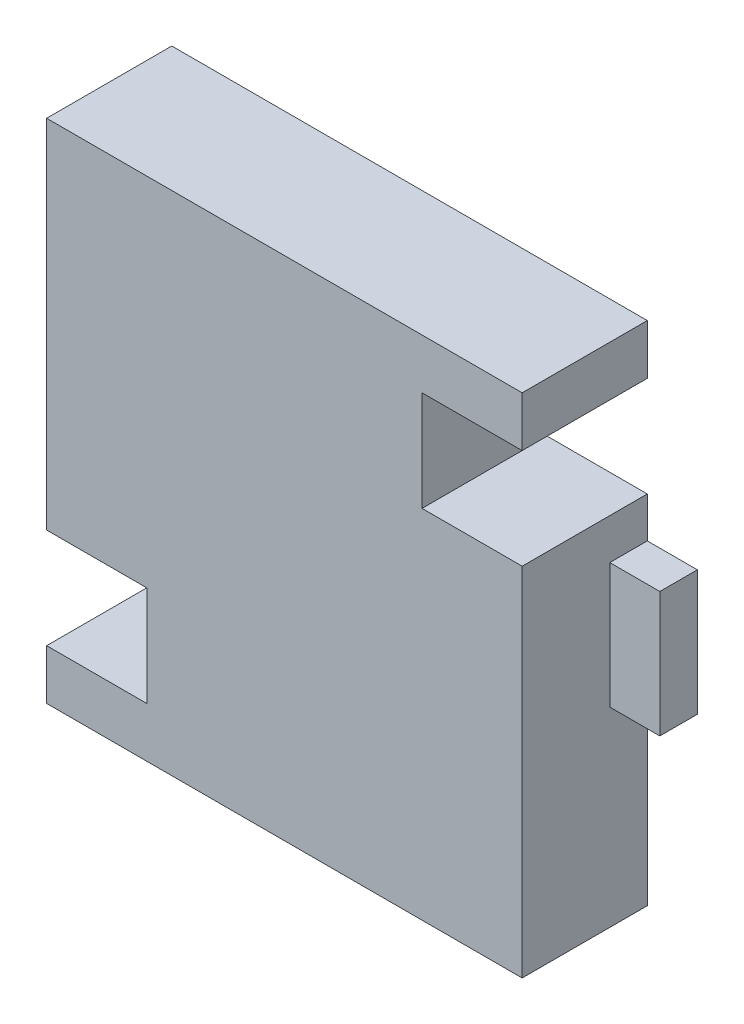
ISO-10303-21;
HEADER;
FILE_DESCRIPTION(('STEP AP214'),'2;1');
FILE_NAME('part.step','',(''),(''),'','','');
FILE_SCHEMA(('AUTOMOTIVE_DESIGN { 1 0 10303 214 1 1 1 1 }'));
ENDSEC;
DATA;
#1=APPLICATION_CONTEXT('core data for automotive mechanical design processes');
#2=APPLICATION_PROTOCOL_DEFINITION('international standard','automotive_design',2000,#1);
#3=PRODUCT_CONTEXT('',#1,'mechanical');
#4=PRODUCT('Part','Part','',(#3));
#5=PRODUCT_RELATED_PRODUCT_CATEGORY('part','',(#4));
#6=PRODUCT_DEFINITION_FORMATION('','',#4);
#7=PRODUCT_DEFINITION_CONTEXT('part definition',#1,'design');
#8=PRODUCT_DEFINITION('design','',#6,#7);
#9=PRODUCT_DEFINITION_SHAPE('','',#8);
#10=(LENGTH_UNIT() NAMED_UNIT(*) SI_UNIT(.MILLI.,.METRE.));
#11=(NAMED_UNIT(*) PLANE_ANGLE_UNIT() SI_UNIT($,.RADIAN.));
#12=(NAMED_UNIT(*) SI_UNIT($,.STERADIAN.) SOLID_ANGLE_UNIT());
#13=UNCERTAINTY_MEASURE_WITH_UNIT(LENGTH_MEASURE(1.E-05),#10,'distance_accuracy_value','');
#14=(GEOMETRIC_REPRESENTATION_CONTEXT(3) GLOBAL_UNCERTAINTY_ASSIGNED_CONTEXT((#13)) GLOBAL_UNIT_ASSIGNED_CONTEXT((#10,
#11,#12)) REPRESENTATION_CONTEXT('',''));
#15=CARTESIAN_POINT('',(0.,0.,0.));
#16=DIRECTION('',(0.,0.,1.));
#17=DIRECTION('',(1.,0.,0.));
#18=AXIS2_PLACEMENT_3D('',#15,#16,#17);
#19=CARTESIAN_POINT('',(0.,0.,3.));
#20=DIRECTION('',(0.,0.,1.));
#21=DIRECTION('',(1.,0.,0.));
#22=AXIS2_PLACEMENT_3D('',#19,#20,#21);
#23=PLANE('',#22);
#24=DIRECTION('',(0.,1.,0.));
#25=VECTOR('',#24,1.);
#26=CARTESIAN_POINT('',(38.,-40.5,3.));
#27=LINE('',#26,#25);
#28=CARTESIAN_POINT('',(38.,-25.25,3.));
#29=VERTEX_POINT('',#28);
#30=CARTESIAN_POINT('',(38.,-15.25,3.));
#31=VERTEX_POINT('',#30);
#32=EDGE_CURVE('E11',#29,#31,#27,.T.);
#33=ORIENTED_EDGE('',*,*,#32,.F.);
#34=DIRECTION('',(1.,0.,0.));
#35=VECTOR('',#34,1.);
#36=CARTESIAN_POINT('',(42.,-25.25,3.));
#37=LINE('',#36,#35);
#38=CARTESIAN_POINT('',(42.,-25.25,3.));
#39=VERTEX_POINT('',#38);
#40=EDGE_CURVE('E155',#29,#39,#37,.T.);
#41=ORIENTED_EDGE('',*,*,#40,.T.);
#42=DIRECTION('',(0.,1.,0.));
#43=VECTOR('',#42,1.);
#44=CARTESIAN_POINT('',(42.,-15.25,3.));
#45=LINE('',#44,#43);
#46=CARTESIAN_POINT('',(42.,-15.25,3.));
#47=VERTEX_POINT('',#46);
#48=EDGE_CURVE('E158',#39,#47,#45,.T.);
#49=ORIENTED_EDGE('',*,*,#48,.T.);
#50=DIRECTION('',(-1.,0.,0.));
#51=VECTOR('',#50,1.);
#52=CARTESIAN_POINT('',(38.,-15.25,3.));
#53=LINE('',#52,#51);
#54=EDGE_CURVE('E60',#47,#31,#53,.T.);
#55=ORIENTED_EDGE('',*,*,#54,.T.);
#56=EDGE_LOOP('',(#33,#41,#49,#55));
#57=FACE_BOUND('',#56,.T.);
#58=ADVANCED_FACE('F41',(#57),#23,.T.);
#59=CARTESIAN_POINT('',(38.,0.,3.));
#60=DIRECTION('',(0.,-1.,0.));
#61=DIRECTION('',(1.,0.,0.));
#62=AXIS2_PLACEMENT_3D('',#59,#60,#61);
#63=PLANE('',#62);
#64=DIRECTION('',(-1.,0.,0.));
#65=VECTOR('',#64,1.);
#66=CARTESIAN_POINT('',(38.,0.,0.));
#67=LINE('',#66,#65);
#68=CARTESIAN_POINT('',(38.,0.,0.));
#69=VERTEX_POINT('',#68);
#70=CARTESIAN_POINT('',(0.,0.,0.));
#71=VERTEX_POINT('',#70);
#72=EDGE_CURVE('E182',#69,#71,#67,.T.);
#73=ORIENTED_EDGE('',*,*,#72,.T.);
#74=DIRECTION('',(0.,0.,-1.));
#75=VECTOR('',#74,1.);
#76=CARTESIAN_POINT('',(0.,0.,3.));
#77=LINE('',#76,#75);
#78=CARTESIAN_POINT('',(0.,0.,10.));
#79=VERTEX_POINT('',#78);
#80=EDGE_CURVE('E45',#79,#71,#77,.T.);
#81=ORIENTED_EDGE('',*,*,#80,.F.);
#82=DIRECTION('',(-1.,0.,0.));
#83=VECTOR('',#82,1.);
#84=CARTESIAN_POINT('',(38.,0.,10.));
#85=LINE('',#84,#83);
#86=CARTESIAN_POINT('',(38.,0.,10.));
#87=VERTEX_POINT('',#86);
#88=EDGE_CURVE('E348',#87,#79,#85,.T.);
#89=ORIENTED_EDGE('',*,*,#88,.F.);
#90=DIRECTION('',(0.,0.,-1.));
#91=VECTOR('',#90,1.);
#92=CARTESIAN_POINT('',(38.,0.,3.));
#93=LINE('',#92,#91);
#94=EDGE_CURVE('E178',#87,#69,#93,.T.);
#95=ORIENTED_EDGE('',*,*,#94,.T.);
#96=EDGE_LOOP('',(#73,#81,#89,#95));
#97=FACE_BOUND('',#96,.T.);
#98=ADVANCED_FACE('F43',(#97),#63,.F.);
#99=CARTESIAN_POINT('',(0.,-15.25,3.));
#100=DIRECTION('',(0.,-1.,0.));
#101=DIRECTION('',(0.,0.,-1.));
#102=AXIS2_PLACEMENT_3D('',#99,#100,#101);
#103=PLANE('',#102);
#104=DIRECTION('',(-1.,0.,0.));
#105=VECTOR('',#104,1.);
#106=CARTESIAN_POINT('',(0.,-15.25,0.));
#107=LINE('',#106,#105);
#108=CARTESIAN_POINT('',(0.,-15.25,0.));
#109=VERTEX_POINT('',#108);
#110=CARTESIAN_POINT('',(-4.,-15.25,0.));
#111=VERTEX_POINT('',#110);
#112=EDGE_CURVE('E188',#109,#111,#107,.T.);
#113=ORIENTED_EDGE('',*,*,#112,.T.);
#114=DIRECTION('',(0.,0.,-1.));
#115=VECTOR('',#114,1.);
#116=CARTESIAN_POINT('',(-4.,-15.25,3.));
#117=LINE('',#116,#115);
#118=CARTESIAN_POINT('',(-4.,-15.25,3.));
#119=VERTEX_POINT('',#118);
#120=EDGE_CURVE('E262',#119,#111,#117,.T.);
#121=ORIENTED_EDGE('',*,*,#120,.F.);
#122=DIRECTION('',(-1.,0.,0.));
#123=VECTOR('',#122,1.);
#124=CARTESIAN_POINT('',(0.,-15.25,3.));
#125=LINE('',#124,#123);
#126=CARTESIAN_POINT('',(0.,-15.25,3.));
#127=VERTEX_POINT('',#126);
#128=EDGE_CURVE('E221',#127,#119,#125,.T.);
#129=ORIENTED_EDGE('',*,*,#128,.F.);
#130=DIRECTION('',(0.,0.,-1.));
#131=VECTOR('',#130,1.);
#132=CARTESIAN_POINT('',(0.,-15.25,3.));
#133=LINE('',#132,#131);
#134=EDGE_CURVE('E264',#127,#109,#133,.T.);
#135=ORIENTED_EDGE('',*,*,#134,.T.);
#136=EDGE_LOOP('',(#113,#121,#129,#135));
#137=FACE_BOUND('',#136,.T.);
#138=ADVANCED_FACE('F376',(#137),#103,.F.);
#139=CARTESIAN_POINT('',(-4.,-15.25,3.));
#140=DIRECTION('',(1.,0.,0.));
#141=DIRECTION('',(0.,1.,0.));
#142=AXIS2_PLACEMENT_3D('',#139,#140,#141);
#143=PLANE('',#142);
#144=DIRECTION('',(0.,-1.,0.));
#145=VECTOR('',#144,1.);
#146=CARTESIAN_POINT('',(-4.,-15.25,0.));
#147=LINE('',#146,#145);
#148=CARTESIAN_POINT('',(-4.,-25.25,0.));
#149=VERTEX_POINT('',#148);
#150=EDGE_CURVE('E190',#111,#149,#147,.T.);
#151=ORIENTED_EDGE('',*,*,#150,.T.);
#152=DIRECTION('',(0.,0.,-1.));
#153=VECTOR('',#152,1.);
#154=CARTESIAN_POINT('',(-4.,-25.25,3.));
#155=LINE('',#154,#153);
#156=CARTESIAN_POINT('',(-4.,-25.25,3.));
#157=VERTEX_POINT('',#156);
#158=EDGE_CURVE('E259',#157,#149,#155,.T.);
#159=ORIENTED_EDGE('',*,*,#158,.F.);
#160=DIRECTION('',(0.,-1.,0.));
#161=VECTOR('',#160,1.);
#162=CARTESIAN_POINT('',(-4.,-15.25,3.));
#163=LINE('',#162,#161);
#164=EDGE_CURVE('E278',#119,#157,#163,.T.);
#165=ORIENTED_EDGE('',*,*,#164,.F.);
#166=ORIENTED_EDGE('',*,*,#120,.T.);
#167=EDGE_LOOP('',(#151,#159,#165,#166));
#168=FACE_BOUND('',#167,.T.);
#169=ADVANCED_FACE('F378',(#168),#143,.F.);
#170=CARTESIAN_POINT('',(-4.,-25.25,3.));
#171=DIRECTION('',(0.,1.,0.));
#172=DIRECTION('',(0.,0.,1.));
#173=AXIS2_PLACEMENT_3D('',#170,#171,#172);
#174=PLANE('',#173);
#175=DIRECTION('',(1.,0.,0.));
#176=VECTOR('',#175,1.);
#177=CARTESIAN_POINT('',(-4.,-25.25,0.));
#178=LINE('',#177,#176);
#179=CARTESIAN_POINT('',(0.,-25.25,0.));
#180=VERTEX_POINT('',#179);
#181=EDGE_CURVE('E192',#149,#180,#178,.T.);
#182=ORIENTED_EDGE('',*,*,#181,.T.);
#183=DIRECTION('',(0.,0.,-1.));
#184=VECTOR('',#183,1.);
#185=CARTESIAN_POINT('',(0.,-25.25,3.));
#186=LINE('',#185,#184);
#187=CARTESIAN_POINT('',(0.,-25.25,3.));
#188=VERTEX_POINT('',#187);
#189=EDGE_CURVE('E256',#188,#180,#186,.T.);
#190=ORIENTED_EDGE('',*,*,#189,.F.);
#191=DIRECTION('',(1.,0.,0.));
#192=VECTOR('',#191,1.);
#193=CARTESIAN_POINT('',(-4.,-25.25,3.));
#194=LINE('',#193,#192);
#195=EDGE_CURVE('E163',#157,#188,#194,.T.);
#196=ORIENTED_EDGE('',*,*,#195,.F.);
#197=ORIENTED_EDGE('',*,*,#158,.T.);
#198=EDGE_LOOP('',(#182,#190,#196,#197));
#199=FACE_BOUND('',#198,.T.);
#200=ADVANCED_FACE('F285',(#199),#174,.F.);
#201=CARTESIAN_POINT('',(0.,-25.25,3.));
#202=DIRECTION('',(1.,0.,0.));
#203=DIRECTION('',(0.,1.,0.));
#204=AXIS2_PLACEMENT_3D('',#201,#202,#203);
#205=PLANE('',#204);
#206=DIRECTION('',(0.,-1.,0.));
#207=VECTOR('',#206,1.);
#208=CARTESIAN_POINT('',(0.,-25.25,0.));
#209=LINE('',#208,#207);
#210=CARTESIAN_POINT('',(0.,-28.4999999999967,0.));
#211=VERTEX_POINT('',#210);
#212=EDGE_CURVE('E194',#180,#211,#209,.T.);
#213=ORIENTED_EDGE('',*,*,#212,.T.);
#214=DIRECTION('',(0.,0.,-1.));
#215=VECTOR('',#214,1.);
#216=CARTESIAN_POINT('',(0.,-28.4999999999967,3.));
#217=LINE('',#216,#215);
#218=CARTESIAN_POINT('',(0.,-28.4999999999967,10.));
#219=VERTEX_POINT('',#218);
#220=EDGE_CURVE('E253',#219,#211,#217,.T.);
#221=ORIENTED_EDGE('',*,*,#220,.F.);
#222=DIRECTION('',(0.,-1.,0.));
#223=VECTOR('',#222,1.);
#224=CARTESIAN_POINT('',(0.,0.,10.));
#225=LINE('',#224,#223);
#226=EDGE_CURVE('E320',#79,#219,#225,.T.);
#227=ORIENTED_EDGE('',*,*,#226,.F.);
#228=ORIENTED_EDGE('',*,*,#80,.T.);
#229=DIRECTION('',(0.,-1.,0.));
#230=VECTOR('',#229,1.);
#231=CARTESIAN_POINT('',(0.,0.,0.));
#232=LINE('',#231,#230);
#233=EDGE_CURVE('E185',#71,#109,#232,.T.);
#234=ORIENTED_EDGE('',*,*,#233,.T.);
#235=ORIENTED_EDGE('',*,*,#134,.F.);
#236=DIRECTION('',(0.,-1.,0.));
#237=VECTOR('',#236,1.);
#238=CARTESIAN_POINT('',(0.,0.,3.));
#239=LINE('',#238,#237);
#240=EDGE_CURVE('E51',#127,#188,#239,.T.);
#241=ORIENTED_EDGE('',*,*,#240,.T.);
#242=ORIENTED_EDGE('',*,*,#189,.T.);
#243=EDGE_LOOP('',(#213,#221,#227,#228,#234,#235,#241,#242));
#244=FACE_BOUND('',#243,.T.);
#245=ADVANCED_FACE('F288',(#244),#205,.F.);
#246=CARTESIAN_POINT('',(0.,-28.4999999999967,3.));
#247=DIRECTION('',(0.,1.,0.));
#248=DIRECTION('',(0.,0.,1.));
#249=AXIS2_PLACEMENT_3D('',#246,#247,#248);
#250=PLANE('',#249);
#251=DIRECTION('',(1.,0.,0.));
#252=VECTOR('',#251,1.);
#253=CARTESIAN_POINT('',(0.,-28.4999999999967,0.));
#254=LINE('',#253,#252);
#255=CARTESIAN_POINT('',(7.99999999999999,-28.4999999999967,0.));
#256=VERTEX_POINT('',#255);
#257=EDGE_CURVE('E196',#211,#256,#254,.T.);
#258=ORIENTED_EDGE('',*,*,#257,.T.);
#259=DIRECTION('',(0.,0.,-1.));
#260=VECTOR('',#259,1.);
#261=CARTESIAN_POINT('',(7.99999999999999,-28.4999999999967,3.));
#262=LINE('',#261,#260);
#263=CARTESIAN_POINT('',(7.99999999999999,-28.4999999999967,10.));
#264=VERTEX_POINT('',#263);
#265=EDGE_CURVE('E250',#264,#256,#262,.T.);
#266=ORIENTED_EDGE('',*,*,#265,.F.);
#267=DIRECTION('',(1.,0.,0.));
#268=VECTOR('',#267,1.);
#269=CARTESIAN_POINT('',(0.,-28.4999999999967,10.));
#270=LINE('',#269,#268);
#271=EDGE_CURVE('E316',#219,#264,#270,.T.);
#272=ORIENTED_EDGE('',*,*,#271,.F.);
#273=ORIENTED_EDGE('',*,*,#220,.T.);
#274=EDGE_LOOP('',(#258,#266,#272,#273));
#275=FACE_BOUND('',#274,.T.);
#276=ADVANCED_FACE('F299',(#275),#250,.F.);
#277=CARTESIAN_POINT('',(7.99999999999999,-28.4999999999967,3.));
#278=DIRECTION('',(1.,0.,0.));
#279=DIRECTION('',(0.,1.,0.));
#280=AXIS2_PLACEMENT_3D('',#277,#278,#279);
#281=PLANE('',#280);
#282=DIRECTION('',(0.,-1.,0.));
#283=VECTOR('',#282,1.);
#284=CARTESIAN_POINT('',(7.99999999999999,-28.4999999999967,0.));
#285=LINE('',#284,#283);
#286=CARTESIAN_POINT('',(8.,-36.4999999999968,0.));
#287=VERTEX_POINT('',#286);
#288=EDGE_CURVE('E198',#256,#287,#285,.T.);
#289=ORIENTED_EDGE('',*,*,#288,.T.);
#290=DIRECTION('',(0.,0.,-1.));
#291=VECTOR('',#290,1.);
#292=CARTESIAN_POINT('',(8.,-36.4999999999968,3.));
#293=LINE('',#292,#291);
#294=CARTESIAN_POINT('',(8.,-36.4999999999968,10.));
#295=VERTEX_POINT('',#294);
#296=EDGE_CURVE('E247',#295,#287,#293,.T.);
#297=ORIENTED_EDGE('',*,*,#296,.F.);
#298=DIRECTION('',(0.,-1.,0.));
#299=VECTOR('',#298,1.);
#300=CARTESIAN_POINT('',(7.99999999999999,-28.4999999999967,10.));
#301=LINE('',#300,#299);
#302=EDGE_CURVE('E308',#264,#295,#301,.T.);
#303=ORIENTED_EDGE('',*,*,#302,.F.);
#304=ORIENTED_EDGE('',*,*,#265,.T.);
#305=EDGE_LOOP('',(#289,#297,#303,#304));
#306=FACE_BOUND('',#305,.T.);
#307=ADVANCED_FACE('F305',(#306),#281,.F.);
#308=CARTESIAN_POINT('',(8.,-36.4999999999968,3.));
#309=DIRECTION('',(0.,-1.,0.));
#310=DIRECTION('',(0.,0.,-1.));
#311=AXIS2_PLACEMENT_3D('',#308,#309,#310);
#312=PLANE('',#311);
#313=DIRECTION('',(-1.,0.,0.));
#314=VECTOR('',#313,1.);
#315=CARTESIAN_POINT('',(8.,-36.4999999999968,0.));
#316=LINE('',#315,#314);
#317=CARTESIAN_POINT('',(0.,-36.4999999999968,0.));
#318=VERTEX_POINT('',#317);
#319=EDGE_CURVE('E200',#287,#318,#316,.T.);
#320=ORIENTED_EDGE('',*,*,#319,.T.);
#321=DIRECTION('',(0.,0.,-1.));
#322=VECTOR('',#321,1.);
#323=CARTESIAN_POINT('',(0.,-36.4999999999968,3.));
#324=LINE('',#323,#322);
#325=CARTESIAN_POINT('',(0.,-36.4999999999968,10.));
#326=VERTEX_POINT('',#325);
#327=EDGE_CURVE('E244',#326,#318,#324,.T.);
#328=ORIENTED_EDGE('',*,*,#327,.F.);
#329=DIRECTION('',(-1.,0.,0.));
#330=VECTOR('',#329,1.);
#331=CARTESIAN_POINT('',(8.,-36.4999999999968,10.));
#332=LINE('',#331,#330);
#333=EDGE_CURVE('E315',#295,#326,#332,.T.);
#334=ORIENTED_EDGE('',*,*,#333,.F.);
#335=ORIENTED_EDGE('',*,*,#296,.T.);
#336=EDGE_LOOP('',(#320,#328,#334,#335));
#337=FACE_BOUND('',#336,.T.);
#338=ADVANCED_FACE('F432',(#337),#312,.F.);
#339=CARTESIAN_POINT('',(0.,-36.4999999999968,3.));
#340=DIRECTION('',(1.,0.,0.));
#341=DIRECTION('',(0.,1.,0.));
#342=AXIS2_PLACEMENT_3D('',#339,#340,#341);
#343=PLANE('',#342);
#344=DIRECTION('',(0.,-1.,0.));
#345=VECTOR('',#344,1.);
#346=CARTESIAN_POINT('',(0.,-36.4999999999968,0.));
#347=LINE('',#346,#345);
#348=CARTESIAN_POINT('',(0.,-40.5,0.));
#349=VERTEX_POINT('',#348);
#350=EDGE_CURVE('E202',#318,#349,#347,.T.);
#351=ORIENTED_EDGE('',*,*,#350,.T.);
#352=DIRECTION('',(0.,0.,-1.));
#353=VECTOR('',#352,1.);
#354=CARTESIAN_POINT('',(0.,-40.5,3.));
#355=LINE('',#354,#353);
#356=CARTESIAN_POINT('',(0.,-40.5,10.));
#357=VERTEX_POINT('',#356);
#358=EDGE_CURVE('E241',#357,#349,#355,.T.);
#359=ORIENTED_EDGE('',*,*,#358,.F.);
#360=DIRECTION('',(0.,-1.,0.));
#361=VECTOR('',#360,1.);
#362=CARTESIAN_POINT('',(0.,-36.4999999999968,10.));
#363=LINE('',#362,#361);
#364=EDGE_CURVE('E318',#326,#357,#363,.T.);
#365=ORIENTED_EDGE('',*,*,#364,.F.);
#366=ORIENTED_EDGE('',*,*,#327,.T.);
#367=EDGE_LOOP('',(#351,#359,#365,#366));
#368=FACE_BOUND('',#367,.T.);
#369=ADVANCED_FACE('F428',(#368),#343,.F.);
#370=CARTESIAN_POINT('',(0.,-40.5,3.));
#371=DIRECTION('',(0.,1.,0.));
#372=DIRECTION('',(-1.,0.,0.));
#373=AXIS2_PLACEMENT_3D('',#370,#371,#372);
#374=PLANE('',#373);
#375=DIRECTION('',(1.,0.,0.));
#376=VECTOR('',#375,1.);
#377=CARTESIAN_POINT('',(0.,-40.5,0.));
#378=LINE('',#377,#376);
#379=CARTESIAN_POINT('',(38.,-40.5,0.));
#380=VERTEX_POINT('',#379);
#381=EDGE_CURVE('E204',#349,#380,#378,.T.);
#382=ORIENTED_EDGE('',*,*,#381,.T.);
#383=DIRECTION('',(0.,0.,-1.));
#384=VECTOR('',#383,1.);
#385=CARTESIAN_POINT('',(38.,-40.5,3.));
#386=LINE('',#385,#384);
#387=CARTESIAN_POINT('',(38.,-40.5,10.));
#388=VERTEX_POINT('',#387);
#389=EDGE_CURVE('E238',#388,#380,#386,.T.);
#390=ORIENTED_EDGE('',*,*,#389,.F.);
#391=DIRECTION('',(1.,0.,0.));
#392=VECTOR('',#391,1.);
#393=CARTESIAN_POINT('',(0.,-40.5,10.));
#394=LINE('',#393,#392);
#395=EDGE_CURVE('E326',#357,#388,#394,.T.);
#396=ORIENTED_EDGE('',*,*,#395,.F.);
#397=ORIENTED_EDGE('',*,*,#358,.T.);
#398=EDGE_LOOP('',(#382,#390,#396,#397));
#399=FACE_BOUND('',#398,.T.);
#400=ADVANCED_FACE('F425',(#399),#374,.F.);
#401=CARTESIAN_POINT('',(42.,-25.25,3.));
#402=DIRECTION('',(0.,1.,0.));
#403=DIRECTION('',(-1.,0.,0.));
#404=AXIS2_PLACEMENT_3D('',#401,#402,#403);
#405=PLANE('',#404);
#406=DIRECTION('',(1.,0.,0.));
#407=VECTOR('',#406,1.);
#408=CARTESIAN_POINT('',(42.,-25.25,0.));
#409=LINE('',#408,#407);
#410=CARTESIAN_POINT('',(38.,-25.25,0.));
#411=VERTEX_POINT('',#410);
#412=CARTESIAN_POINT('',(42.,-25.25,0.));
#413=VERTEX_POINT('',#412);
#414=EDGE_CURVE('E169',#411,#413,#409,.T.);
#415=ORIENTED_EDGE('',*,*,#414,.T.);
#416=DIRECTION('',(0.,0.,-1.));
#417=VECTOR('',#416,1.);
#418=CARTESIAN_POINT('',(42.,-25.25,3.));
#419=LINE('',#418,#417);
#420=EDGE_CURVE('E166',#39,#413,#419,.T.);
#421=ORIENTED_EDGE('',*,*,#420,.F.);
#422=ORIENTED_EDGE('',*,*,#40,.F.);
#423=DIRECTION('',(0.,0.,-1.));
#424=VECTOR('',#423,1.);
#425=CARTESIAN_POINT('',(38.,-25.25,3.));
#426=LINE('',#425,#424);
#427=EDGE_CURVE('E172',#29,#411,#426,.T.);
#428=ORIENTED_EDGE('',*,*,#427,.T.);
#429=EDGE_LOOP('',(#415,#421,#422,#428));
#430=FACE_BOUND('',#429,.T.);
#431=ADVANCED_FACE('F167',(#430),#405,.F.);
#432=CARTESIAN_POINT('',(42.,-15.25,3.));
#433=DIRECTION('',(-1.,0.,0.));
#434=DIRECTION('',(0.,0.,1.));
#435=AXIS2_PLACEMENT_3D('',#432,#433,#434);
#436=PLANE('',#435);
#437=DIRECTION('',(0.,1.,0.));
#438=VECTOR('',#437,1.);
#439=CARTESIAN_POINT('',(42.,-15.25,0.));
#440=LINE('',#439,#438);
#441=CARTESIAN_POINT('',(42.,-15.25,0.));
#442=VERTEX_POINT('',#441);
#443=EDGE_CURVE('E209',#413,#442,#440,.T.);
#444=ORIENTED_EDGE('',*,*,#443,.T.);
#445=DIRECTION('',(0.,0.,-1.));
#446=VECTOR('',#445,1.);
#447=CARTESIAN_POINT('',(42.,-15.25,3.));
#448=LINE('',#447,#446);
#449=EDGE_CURVE('E173',#47,#442,#448,.T.);
#450=ORIENTED_EDGE('',*,*,#449,.F.);
#451=ORIENTED_EDGE('',*,*,#48,.F.);
#452=ORIENTED_EDGE('',*,*,#420,.T.);
#453=EDGE_LOOP('',(#444,#450,#451,#452));
#454=FACE_BOUND('',#453,.T.);
#455=ADVANCED_FACE('F175',(#454),#436,.F.);
#456=CARTESIAN_POINT('',(38.,-15.25,3.));
#457=DIRECTION('',(0.,-1.,0.));
#458=DIRECTION('',(0.,0.,-1.));
#459=AXIS2_PLACEMENT_3D('',#456,#457,#458);
#460=PLANE('',#459);
#461=DIRECTION('',(-1.,0.,0.));
#462=VECTOR('',#461,1.);
#463=CARTESIAN_POINT('',(38.,-15.25,0.));
#464=LINE('',#463,#462);
#465=CARTESIAN_POINT('',(38.,-15.25,0.));
#466=VERTEX_POINT('',#465);
#467=EDGE_CURVE('E211',#442,#466,#464,.T.);
#468=ORIENTED_EDGE('',*,*,#467,.T.);
#469=DIRECTION('',(0.,0.,-1.));
#470=VECTOR('',#469,1.);
#471=CARTESIAN_POINT('',(38.,-15.25,3.));
#472=LINE('',#471,#470);
#473=EDGE_CURVE('E233',#31,#466,#472,.T.);
#474=ORIENTED_EDGE('',*,*,#473,.F.);
#475=ORIENTED_EDGE('',*,*,#54,.F.);
#476=ORIENTED_EDGE('',*,*,#449,.T.);
#477=EDGE_LOOP('',(#468,#474,#475,#476));
#478=FACE_BOUND('',#477,.T.);
#479=ADVANCED_FACE('F417',(#478),#460,.F.);
#480=CARTESIAN_POINT('',(38.,-12.0000000000033,3.));
#481=DIRECTION('',(-1.,0.,0.));
#482=DIRECTION('',(0.,0.,1.));
#483=AXIS2_PLACEMENT_3D('',#480,#481,#482);
#484=PLANE('',#483);
#485=DIRECTION('',(0.,1.,0.));
#486=VECTOR('',#485,1.);
#487=CARTESIAN_POINT('',(38.,-12.0000000000033,0.));
#488=LINE('',#487,#486);
#489=CARTESIAN_POINT('',(38.,-12.0000000000033,0.));
#490=VERTEX_POINT('',#489);
#491=EDGE_CURVE('E213',#466,#490,#488,.T.);
#492=ORIENTED_EDGE('',*,*,#491,.T.);
#493=DIRECTION('',(0.,0.,-1.));
#494=VECTOR('',#493,1.);
#495=CARTESIAN_POINT('',(38.,-12.0000000000033,3.));
#496=LINE('',#495,#494);
#497=CARTESIAN_POINT('',(38.,-12.0000000000033,10.));
#498=VERTEX_POINT('',#497);
#499=EDGE_CURVE('E230',#498,#490,#496,.T.);
#500=ORIENTED_EDGE('',*,*,#499,.F.);
#501=DIRECTION('',(0.,1.,0.));
#502=VECTOR('',#501,1.);
#503=CARTESIAN_POINT('',(38.,-40.5,10.));
#504=LINE('',#503,#502);
#505=EDGE_CURVE('E329',#388,#498,#504,.T.);
#506=ORIENTED_EDGE('',*,*,#505,.F.);
#507=ORIENTED_EDGE('',*,*,#389,.T.);
#508=DIRECTION('',(0.,1.,0.));
#509=VECTOR('',#508,1.);
#510=CARTESIAN_POINT('',(38.,-25.25,0.));
#511=LINE('',#510,#509);
#512=EDGE_CURVE('E206',#380,#411,#511,.T.);
#513=ORIENTED_EDGE('',*,*,#512,.T.);
#514=ORIENTED_EDGE('',*,*,#427,.F.);
#515=ORIENTED_EDGE('',*,*,#32,.T.);
#516=ORIENTED_EDGE('',*,*,#473,.T.);
#517=EDGE_LOOP('',(#492,#500,#506,#507,#513,#514,#515,#516));
#518=FACE_BOUND('',#517,.T.);
#519=ADVANCED_FACE('F413',(#518),#484,.F.);
#520=CARTESIAN_POINT('',(30.,-12.0000000000033,3.));
#521=DIRECTION('',(0.,-1.,0.));
#522=DIRECTION('',(0.,0.,-1.));
#523=AXIS2_PLACEMENT_3D('',#520,#521,#522);
#524=PLANE('',#523);
#525=DIRECTION('',(-1.,0.,0.));
#526=VECTOR('',#525,1.);
#527=CARTESIAN_POINT('',(30.,-12.0000000000033,0.));
#528=LINE('',#527,#526);
#529=CARTESIAN_POINT('',(30.,-12.0000000000033,0.));
#530=VERTEX_POINT('',#529);
#531=EDGE_CURVE('E215',#490,#530,#528,.T.);
#532=ORIENTED_EDGE('',*,*,#531,.T.);
#533=DIRECTION('',(0.,0.,-1.));
#534=VECTOR('',#533,1.);
#535=CARTESIAN_POINT('',(30.,-12.0000000000033,3.));
#536=LINE('',#535,#534);
#537=CARTESIAN_POINT('',(30.,-12.0000000000033,10.));
#538=VERTEX_POINT('',#537);
#539=EDGE_CURVE('E227',#538,#530,#536,.T.);
#540=ORIENTED_EDGE('',*,*,#539,.F.);
#541=DIRECTION('',(-1.,0.,0.));
#542=VECTOR('',#541,1.);
#543=CARTESIAN_POINT('',(38.,-12.0000000000033,10.));
#544=LINE('',#543,#542);
#545=EDGE_CURVE('E332',#498,#538,#544,.T.);
#546=ORIENTED_EDGE('',*,*,#545,.F.);
#547=ORIENTED_EDGE('',*,*,#499,.T.);
#548=EDGE_LOOP('',(#532,#540,#546,#547));
#549=FACE_BOUND('',#548,.T.);
#550=ADVANCED_FACE('F409',(#549),#524,.F.);
#551=CARTESIAN_POINT('',(30.,-4.00000000000327,3.));
#552=DIRECTION('',(-1.,0.,0.));
#553=DIRECTION('',(0.,0.,1.));
#554=AXIS2_PLACEMENT_3D('',#551,#552,#553);
#555=PLANE('',#554);
#556=DIRECTION('',(0.,1.,0.));
#557=VECTOR('',#556,1.);
#558=CARTESIAN_POINT('',(30.,-4.00000000000327,0.));
#559=LINE('',#558,#557);
#560=CARTESIAN_POINT('',(30.,-4.00000000000327,0.));
#561=VERTEX_POINT('',#560);
#562=EDGE_CURVE('E217',#530,#561,#559,.T.);
#563=ORIENTED_EDGE('',*,*,#562,.T.);
#564=DIRECTION('',(0.,0.,-1.));
#565=VECTOR('',#564,1.);
#566=CARTESIAN_POINT('',(30.,-4.00000000000327,3.));
#567=LINE('',#566,#565);
#568=CARTESIAN_POINT('',(30.,-4.00000000000327,10.));
#569=VERTEX_POINT('',#568);
#570=EDGE_CURVE('E225',#569,#561,#567,.T.);
#571=ORIENTED_EDGE('',*,*,#570,.F.);
#572=DIRECTION('',(0.,1.,0.));
#573=VECTOR('',#572,1.);
#574=CARTESIAN_POINT('',(30.,-12.0000000000033,10.));
#575=LINE('',#574,#573);
#576=EDGE_CURVE('E335',#538,#569,#575,.T.);
#577=ORIENTED_EDGE('',*,*,#576,.F.);
#578=ORIENTED_EDGE('',*,*,#539,.T.);
#579=EDGE_LOOP('',(#563,#571,#577,#578));
#580=FACE_BOUND('',#579,.T.);
#581=ADVANCED_FACE('F404',(#580),#555,.F.);
#582=CARTESIAN_POINT('',(38.,-4.00000000000326,3.));
#583=DIRECTION('',(0.,1.,0.));
#584=DIRECTION('',(-1.,0.,0.));
#585=AXIS2_PLACEMENT_3D('',#582,#583,#584);
#586=PLANE('',#585);
#587=DIRECTION('',(1.,0.,0.));
#588=VECTOR('',#587,1.);
#589=CARTESIAN_POINT('',(38.,-4.00000000000326,0.));
#590=LINE('',#589,#588);
#591=CARTESIAN_POINT('',(38.,-4.00000000000326,0.));
#592=VERTEX_POINT('',#591);
#593=EDGE_CURVE('E126',#561,#592,#590,.T.);
#594=ORIENTED_EDGE('',*,*,#593,.T.);
#595=DIRECTION('',(0.,0.,-1.));
#596=VECTOR('',#595,1.);
#597=CARTESIAN_POINT('',(38.,-4.00000000000326,3.));
#598=LINE('',#597,#596);
#599=CARTESIAN_POINT('',(38.,-4.00000000000326,10.));
#600=VERTEX_POINT('',#599);
#601=EDGE_CURVE('E223',#600,#592,#598,.T.);
#602=ORIENTED_EDGE('',*,*,#601,.F.);
#603=DIRECTION('',(1.,0.,0.));
#604=VECTOR('',#603,1.);
#605=CARTESIAN_POINT('',(30.,-4.00000000000327,10.));
#606=LINE('',#605,#604);
#607=EDGE_CURVE('E337',#569,#600,#606,.T.);
#608=ORIENTED_EDGE('',*,*,#607,.F.);
#609=ORIENTED_EDGE('',*,*,#570,.T.);
#610=EDGE_LOOP('',(#594,#602,#608,#609));
#611=FACE_BOUND('',#610,.T.);
#612=ADVANCED_FACE('F372',(#611),#586,.F.);
#613=CARTESIAN_POINT('',(38.,0.,3.));
#614=DIRECTION('',(-1.,0.,0.));
#615=DIRECTION('',(0.,0.,1.));
#616=AXIS2_PLACEMENT_3D('',#613,#614,#615);
#617=PLANE('',#616);
#618=DIRECTION('',(0.,1.,0.));
#619=VECTOR('',#618,1.);
#620=CARTESIAN_POINT('',(38.,0.,0.));
#621=LINE('',#620,#619);
#622=EDGE_CURVE('E133',#592,#69,#621,.T.);
#623=ORIENTED_EDGE('',*,*,#622,.T.);
#624=ORIENTED_EDGE('',*,*,#94,.F.);
#625=DIRECTION('',(0.,1.,0.));
#626=VECTOR('',#625,1.);
#627=CARTESIAN_POINT('',(38.,-4.00000000000326,10.));
#628=LINE('',#627,#626);
#629=EDGE_CURVE('E186',#600,#87,#628,.T.);
#630=ORIENTED_EDGE('',*,*,#629,.F.);
#631=ORIENTED_EDGE('',*,*,#601,.T.);
#632=EDGE_LOOP('',(#623,#624,#630,#631));
#633=FACE_BOUND('',#632,.T.);
#634=ADVANCED_FACE('F373',(#633),#617,.F.);
#635=ORIENTED_EDGE('',*,*,#240,.F.);
#636=ORIENTED_EDGE('',*,*,#128,.T.);
#637=ORIENTED_EDGE('',*,*,#164,.T.);
#638=ORIENTED_EDGE('',*,*,#195,.T.);
#639=EDGE_LOOP('',(#635,#636,#637,#638));
#640=FACE_BOUND('',#639,.T.);
#641=ADVANCED_FACE('F281',(#640),#23,.T.);
#642=CARTESIAN_POINT('',(0.,0.,0.));
#643=DIRECTION('',(0.,0.,1.));
#644=DIRECTION('',(1.,0.,0.));
#645=AXIS2_PLACEMENT_3D('',#642,#643,#644);
#646=PLANE('',#645);
#647=ORIENTED_EDGE('',*,*,#72,.F.);
#648=ORIENTED_EDGE('',*,*,#622,.F.);
#649=ORIENTED_EDGE('',*,*,#593,.F.);
#650=ORIENTED_EDGE('',*,*,#562,.F.);
#651=ORIENTED_EDGE('',*,*,#531,.F.);
#652=ORIENTED_EDGE('',*,*,#491,.F.);
#653=ORIENTED_EDGE('',*,*,#467,.F.);
#654=ORIENTED_EDGE('',*,*,#443,.F.);
#655=ORIENTED_EDGE('',*,*,#414,.F.);
#656=ORIENTED_EDGE('',*,*,#512,.F.);
#657=ORIENTED_EDGE('',*,*,#381,.F.);
#658=ORIENTED_EDGE('',*,*,#350,.F.);
#659=ORIENTED_EDGE('',*,*,#319,.F.);
#660=ORIENTED_EDGE('',*,*,#288,.F.);
#661=ORIENTED_EDGE('',*,*,#257,.F.);
#662=ORIENTED_EDGE('',*,*,#212,.F.);
#663=ORIENTED_EDGE('',*,*,#181,.F.);
#664=ORIENTED_EDGE('',*,*,#150,.F.);
#665=ORIENTED_EDGE('',*,*,#112,.F.);
#666=ORIENTED_EDGE('',*,*,#233,.F.);
#667=EDGE_LOOP('',(#647,#648,#649,#650,#651,#652,#653,#654,#655,#656,#657,#658,#659,#660,#661,
#662,#663,#664,#665,#666));
#668=FACE_BOUND('',#667,.T.);
#669=ADVANCED_FACE('F293',(#668),#646,.F.);
#670=CARTESIAN_POINT('',(0.,0.,10.));
#671=DIRECTION('',(0.,0.,1.));
#672=DIRECTION('',(1.,0.,0.));
#673=AXIS2_PLACEMENT_3D('',#670,#671,#672);
#674=PLANE('',#673);
#675=ORIENTED_EDGE('',*,*,#88,.T.);
#676=ORIENTED_EDGE('',*,*,#226,.T.);
#677=ORIENTED_EDGE('',*,*,#271,.T.);
#678=ORIENTED_EDGE('',*,*,#302,.T.);
#679=ORIENTED_EDGE('',*,*,#333,.T.);
#680=ORIENTED_EDGE('',*,*,#364,.T.);
#681=ORIENTED_EDGE('',*,*,#395,.T.);
#682=ORIENTED_EDGE('',*,*,#505,.T.);
#683=ORIENTED_EDGE('',*,*,#545,.T.);
#684=ORIENTED_EDGE('',*,*,#576,.T.);
#685=ORIENTED_EDGE('',*,*,#607,.T.);
#686=ORIENTED_EDGE('',*,*,#629,.T.);
#687=EDGE_LOOP('',(#675,#676,#677,#678,#679,#680,#681,#682,#683,#684,#685,#686));
#688=FACE_BOUND('',#687,.T.);
#689=ADVANCED_FACE('F345',(#688),#674,.T.);
#690=CLOSED_SHELL('',(#58,#98,#138,#169,#200,#245,#276,#307,#338,#369,#400,#431,#455,#479,#519,
#550,#581,#612,#634,#641,#669,#689));
#691=MANIFOLD_SOLID_BREP('B2',#690);
#692=ADVANCED_BREP_SHAPE_REPRESENTATION('',(#18,#691),#14);
#693=SHAPE_DEFINITION_REPRESENTATION(#9,#692);
ENDSEC;
END-ISO-10303-21;
